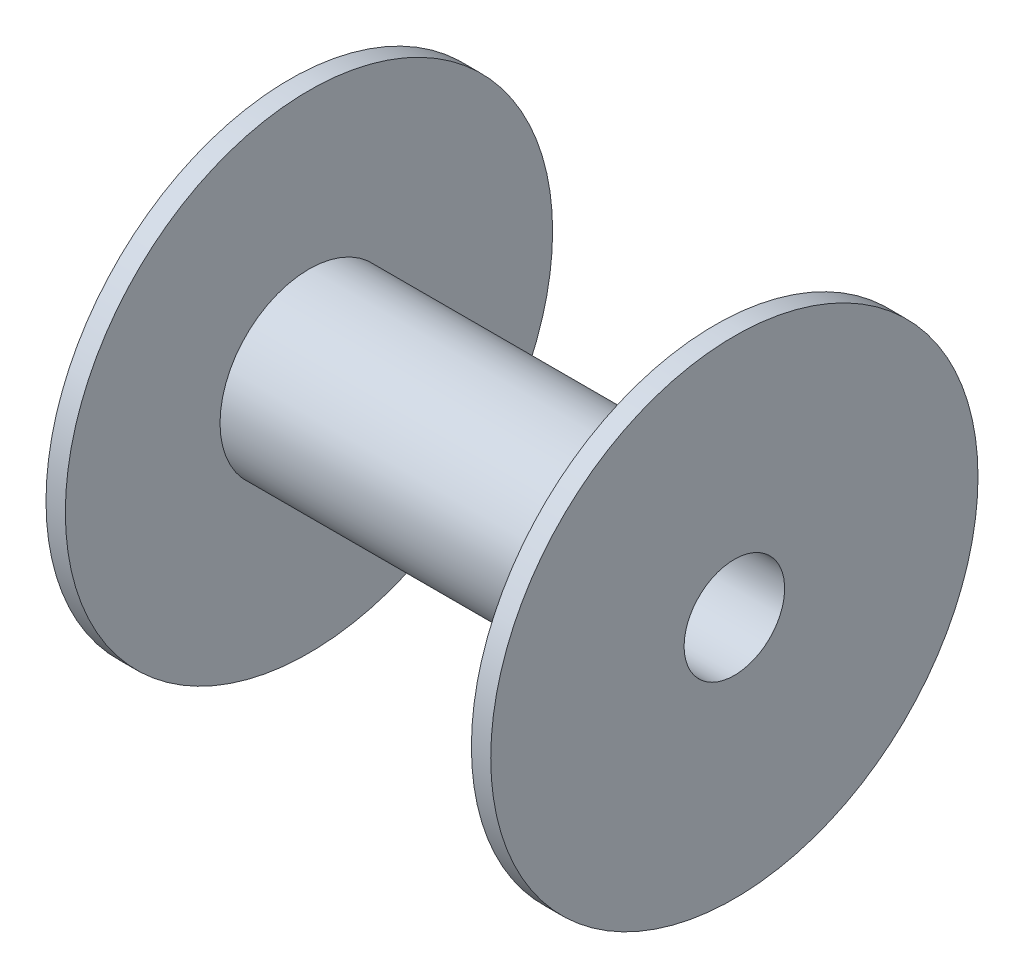
ISO-10303-21;
HEADER;
FILE_DESCRIPTION(('STEP AP214'),'2;1');
FILE_NAME('part.step','',(''),(''),'','','');
FILE_SCHEMA(('AUTOMOTIVE_DESIGN { 1 0 10303 214 1 1 1 1 }'));
ENDSEC;
DATA;
#1=APPLICATION_CONTEXT('core data for automotive mechanical design processes');
#2=APPLICATION_PROTOCOL_DEFINITION('international standard','automotive_design',2000,#1);
#3=PRODUCT_CONTEXT('',#1,'mechanical');
#4=PRODUCT('Part','Part','',(#3));
#5=PRODUCT_RELATED_PRODUCT_CATEGORY('part','',(#4));
#6=PRODUCT_DEFINITION_FORMATION('','',#4);
#7=PRODUCT_DEFINITION_CONTEXT('part definition',#1,'design');
#8=PRODUCT_DEFINITION('design','',#6,#7);
#9=PRODUCT_DEFINITION_SHAPE('','',#8);
#10=(LENGTH_UNIT() NAMED_UNIT(*) SI_UNIT(.MILLI.,.METRE.));
#11=(NAMED_UNIT(*) PLANE_ANGLE_UNIT() SI_UNIT($,.RADIAN.));
#12=(NAMED_UNIT(*) SI_UNIT($,.STERADIAN.) SOLID_ANGLE_UNIT());
#13=UNCERTAINTY_MEASURE_WITH_UNIT(LENGTH_MEASURE(1.E-05),#10,'distance_accuracy_value','');
#14=(GEOMETRIC_REPRESENTATION_CONTEXT(3) GLOBAL_UNCERTAINTY_ASSIGNED_CONTEXT((#13)) GLOBAL_UNIT_ASSIGNED_CONTEXT((#10,
#11,#12)) REPRESENTATION_CONTEXT('',''));
#15=CARTESIAN_POINT('',(0.,0.,0.));
#16=DIRECTION('',(0.,0.,1.));
#17=DIRECTION('',(1.,0.,0.));
#18=AXIS2_PLACEMENT_3D('',#15,#16,#17);
#19=CARTESIAN_POINT('',(-57.5,63.,0.));
#20=DIRECTION('',(1.,0.,0.));
#21=DIRECTION('',(0.,0.,-1.));
#22=AXIS2_PLACEMENT_3D('',#19,#20,#21);
#23=PLANE('',#22);
#24=CARTESIAN_POINT('',(-57.5,0.,0.));
#25=DIRECTION('',(-1.,0.,0.));
#26=DIRECTION('',(0.,0.,1.));
#27=AXIS2_PLACEMENT_3D('',#24,#25,#26);
#28=CIRCLE('',#27,13.);
#29=CARTESIAN_POINT('',(-57.5,0.,13.));
#30=VERTEX_POINT('',#29);
#31=EDGE_CURVE('E10',#30,#30,#28,.T.);
#32=ORIENTED_EDGE('',*,*,#31,.F.);
#33=EDGE_LOOP('',(#32));
#34=FACE_BOUND('',#33,.T.);
#35=CARTESIAN_POINT('',(-57.5,0.,0.));
#36=DIRECTION('',(-1.,0.,0.));
#37=DIRECTION('',(0.,0.,1.));
#38=AXIS2_PLACEMENT_3D('',#35,#36,#37);
#39=CIRCLE('',#38,63.);
#40=CARTESIAN_POINT('',(-57.5,0.,63.));
#41=VERTEX_POINT('',#40);
#42=EDGE_CURVE('E64',#41,#41,#39,.T.);
#43=ORIENTED_EDGE('',*,*,#42,.T.);
#44=EDGE_LOOP('',(#43));
#45=FACE_BOUND('',#44,.T.);
#46=ADVANCED_FACE('F40',(#34,#45),#23,.F.);
#47=CARTESIAN_POINT('',(-70.,0.,0.));
#48=DIRECTION('',(-1.,0.,0.));
#49=DIRECTION('',(0.,0.,1.));
#50=AXIS2_PLACEMENT_3D('',#47,#48,#49);
#51=CYLINDRICAL_SURFACE('',#50,13.);
#52=CARTESIAN_POINT('',(57.5,0.,0.));
#53=DIRECTION('',(-1.,0.,0.));
#54=DIRECTION('',(0.,0.,1.));
#55=AXIS2_PLACEMENT_3D('',#52,#53,#54);
#56=CIRCLE('',#55,13.);
#57=CARTESIAN_POINT('',(57.5,0.,13.));
#58=VERTEX_POINT('',#57);
#59=EDGE_CURVE('E43',#58,#58,#56,.T.);
#60=ORIENTED_EDGE('',*,*,#59,.F.);
#61=EDGE_LOOP('',(#60));
#62=FACE_BOUND('',#61,.T.);
#63=ORIENTED_EDGE('',*,*,#31,.T.);
#64=EDGE_LOOP('',(#63));
#65=FACE_BOUND('',#64,.T.);
#66=ADVANCED_FACE('F105',(#62,#65),#51,.F.);
#67=CARTESIAN_POINT('',(57.5,13.,0.));
#68=DIRECTION('',(-1.,0.,0.));
#69=DIRECTION('',(0.,0.,1.));
#70=AXIS2_PLACEMENT_3D('',#67,#68,#69);
#71=PLANE('',#70);
#72=CARTESIAN_POINT('',(57.5,0.,0.));
#73=DIRECTION('',(-1.,0.,0.));
#74=DIRECTION('',(0.,0.,1.));
#75=AXIS2_PLACEMENT_3D('',#72,#73,#74);
#76=CIRCLE('',#75,63.);
#77=CARTESIAN_POINT('',(57.5,0.,63.));
#78=VERTEX_POINT('',#77);
#79=EDGE_CURVE('E50',#78,#78,#76,.T.);
#80=ORIENTED_EDGE('',*,*,#79,.F.);
#81=EDGE_LOOP('',(#80));
#82=FACE_BOUND('',#81,.T.);
#83=ORIENTED_EDGE('',*,*,#59,.T.);
#84=EDGE_LOOP('',(#83));
#85=FACE_BOUND('',#84,.T.);
#86=ADVANCED_FACE('F100',(#82,#85),#71,.F.);
#87=CARTESIAN_POINT('',(-70.,0.,0.));
#88=DIRECTION('',(-1.,0.,0.));
#89=DIRECTION('',(0.,0.,1.));
#90=AXIS2_PLACEMENT_3D('',#87,#88,#89);
#91=CYLINDRICAL_SURFACE('',#90,63.);
#92=CARTESIAN_POINT('',(52.5,0.,0.));
#93=DIRECTION('',(-1.,0.,0.));
#94=DIRECTION('',(0.,0.,1.));
#95=AXIS2_PLACEMENT_3D('',#92,#93,#94);
#96=CIRCLE('',#95,63.);
#97=CARTESIAN_POINT('',(52.5,0.,63.));
#98=VERTEX_POINT('',#97);
#99=EDGE_CURVE('E51',#98,#98,#96,.T.);
#100=ORIENTED_EDGE('',*,*,#99,.F.);
#101=EDGE_LOOP('',(#100));
#102=FACE_BOUND('',#101,.T.);
#103=ORIENTED_EDGE('',*,*,#79,.T.);
#104=EDGE_LOOP('',(#103));
#105=FACE_BOUND('',#104,.T.);
#106=ADVANCED_FACE('F93',(#102,#105),#91,.T.);
#107=CARTESIAN_POINT('',(52.5,63.,0.));
#108=DIRECTION('',(1.,0.,0.));
#109=DIRECTION('',(0.,0.,-1.));
#110=AXIS2_PLACEMENT_3D('',#107,#108,#109);
#111=PLANE('',#110);
#112=CARTESIAN_POINT('',(52.5,0.,0.));
#113=DIRECTION('',(-1.,0.,0.));
#114=DIRECTION('',(0.,0.,1.));
#115=AXIS2_PLACEMENT_3D('',#112,#113,#114);
#116=CIRCLE('',#115,23.);
#117=CARTESIAN_POINT('',(52.5,0.,23.));
#118=VERTEX_POINT('',#117);
#119=EDGE_CURVE('E57',#118,#118,#116,.T.);
#120=ORIENTED_EDGE('',*,*,#119,.F.);
#121=EDGE_LOOP('',(#120));
#122=FACE_BOUND('',#121,.T.);
#123=ORIENTED_EDGE('',*,*,#99,.T.);
#124=EDGE_LOOP('',(#123));
#125=FACE_BOUND('',#124,.T.);
#126=ADVANCED_FACE('F84',(#122,#125),#111,.F.);
#127=CARTESIAN_POINT('',(-70.,0.,0.));
#128=DIRECTION('',(-1.,0.,0.));
#129=DIRECTION('',(0.,0.,1.));
#130=AXIS2_PLACEMENT_3D('',#127,#128,#129);
#131=CYLINDRICAL_SURFACE('',#130,23.);
#132=CARTESIAN_POINT('',(-52.5,0.,0.));
#133=DIRECTION('',(-1.,0.,0.));
#134=DIRECTION('',(0.,0.,1.));
#135=AXIS2_PLACEMENT_3D('',#132,#133,#134);
#136=CIRCLE('',#135,23.);
#137=CARTESIAN_POINT('',(-52.5,0.,23.));
#138=VERTEX_POINT('',#137);
#139=EDGE_CURVE('E56',#138,#138,#136,.T.);
#140=ORIENTED_EDGE('',*,*,#139,.F.);
#141=EDGE_LOOP('',(#140));
#142=FACE_BOUND('',#141,.T.);
#143=ORIENTED_EDGE('',*,*,#119,.T.);
#144=EDGE_LOOP('',(#143));
#145=FACE_BOUND('',#144,.T.);
#146=ADVANCED_FACE('F78',(#142,#145),#131,.T.);
#147=CARTESIAN_POINT('',(-52.5,63.,0.));
#148=DIRECTION('',(-1.,0.,0.));
#149=DIRECTION('',(0.,0.,1.));
#150=AXIS2_PLACEMENT_3D('',#147,#148,#149);
#151=PLANE('',#150);
#152=CARTESIAN_POINT('',(-52.5,0.,0.));
#153=DIRECTION('',(-1.,0.,0.));
#154=DIRECTION('',(0.,0.,1.));
#155=AXIS2_PLACEMENT_3D('',#152,#153,#154);
#156=CIRCLE('',#155,63.);
#157=CARTESIAN_POINT('',(-52.5,0.,63.));
#158=VERTEX_POINT('',#157);
#159=EDGE_CURVE('E65',#158,#158,#156,.T.);
#160=ORIENTED_EDGE('',*,*,#159,.F.);
#161=EDGE_LOOP('',(#160));
#162=FACE_BOUND('',#161,.T.);
#163=ORIENTED_EDGE('',*,*,#139,.T.);
#164=EDGE_LOOP('',(#163));
#165=FACE_BOUND('',#164,.T.);
#166=ADVANCED_FACE('F71',(#162,#165),#151,.F.);
#167=CARTESIAN_POINT('',(-70.,0.,0.));
#168=DIRECTION('',(-1.,0.,0.));
#169=DIRECTION('',(0.,0.,1.));
#170=AXIS2_PLACEMENT_3D('',#167,#168,#169);
#171=CYLINDRICAL_SURFACE('',#170,63.);
#172=ORIENTED_EDGE('',*,*,#42,.F.);
#173=EDGE_LOOP('',(#172));
#174=FACE_BOUND('',#173,.T.);
#175=ORIENTED_EDGE('',*,*,#159,.T.);
#176=EDGE_LOOP('',(#175));
#177=FACE_BOUND('',#176,.T.);
#178=ADVANCED_FACE('F69',(#174,#177),#171,.T.);
#179=CLOSED_SHELL('',(#46,#66,#86,#106,#126,#146,#166,#178));
#180=MANIFOLD_SOLID_BREP('B2',#179);
#181=ADVANCED_BREP_SHAPE_REPRESENTATION('',(#18,#180),#14);
#182=SHAPE_DEFINITION_REPRESENTATION(#9,#181);
ENDSEC;
END-ISO-10303-21;
